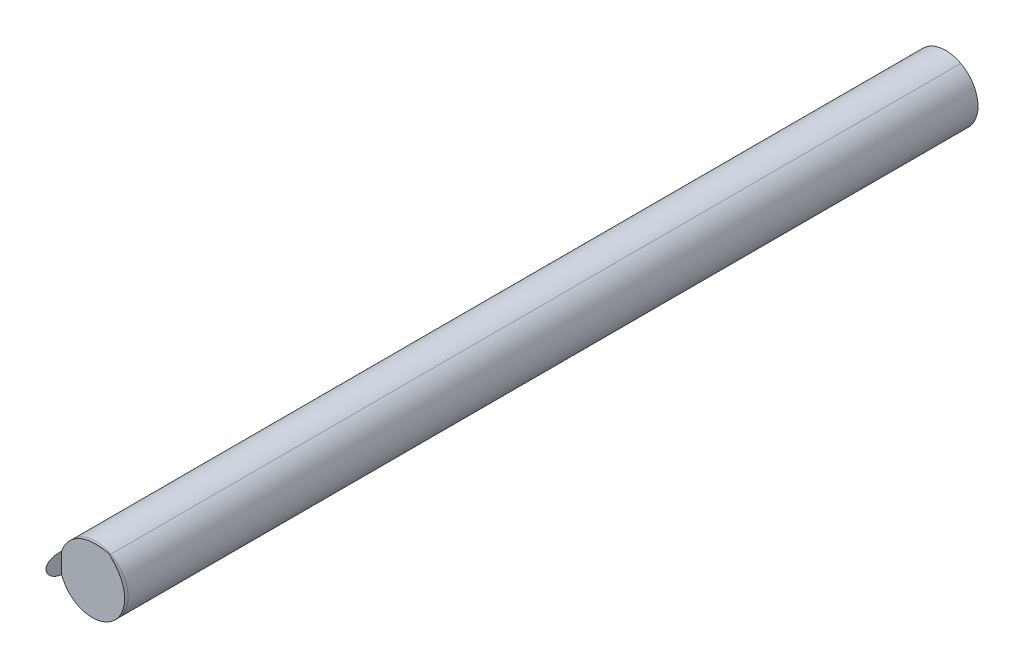
ISO-10303-21;
HEADER;
FILE_DESCRIPTION(('STEP AP214'),'2;1');
FILE_NAME('part.step','',(''),(''),'','','');
FILE_SCHEMA(('AUTOMOTIVE_DESIGN { 1 0 10303 214 1 1 1 1 }'));
ENDSEC;
DATA;
#1=APPLICATION_CONTEXT('core data for automotive mechanical design processes');
#2=APPLICATION_PROTOCOL_DEFINITION('international standard','automotive_design',2000,#1);
#3=PRODUCT_CONTEXT('',#1,'mechanical');
#4=PRODUCT('Part','Part','',(#3));
#5=PRODUCT_RELATED_PRODUCT_CATEGORY('part','',(#4));
#6=PRODUCT_DEFINITION_FORMATION('','',#4);
#7=PRODUCT_DEFINITION_CONTEXT('part definition',#1,'design');
#8=PRODUCT_DEFINITION('design','',#6,#7);
#9=PRODUCT_DEFINITION_SHAPE('','',#8);
#10=(LENGTH_UNIT() NAMED_UNIT(*) SI_UNIT(.MILLI.,.METRE.));
#11=(NAMED_UNIT(*) PLANE_ANGLE_UNIT() SI_UNIT($,.RADIAN.));
#12=(NAMED_UNIT(*) SI_UNIT($,.STERADIAN.) SOLID_ANGLE_UNIT());
#13=UNCERTAINTY_MEASURE_WITH_UNIT(LENGTH_MEASURE(1.E-05),#10,'distance_accuracy_value','');
#14=(GEOMETRIC_REPRESENTATION_CONTEXT(3) GLOBAL_UNCERTAINTY_ASSIGNED_CONTEXT((#13)) GLOBAL_UNIT_ASSIGNED_CONTEXT((#10,
#11,#12)) REPRESENTATION_CONTEXT('',''));
#15=CARTESIAN_POINT('',(0.,0.,0.));
#16=DIRECTION('',(0.,0.,1.));
#17=DIRECTION('',(1.,0.,0.));
#18=AXIS2_PLACEMENT_3D('',#15,#16,#17);
#19=CARTESIAN_POINT('',(-2.527062506593,0.304851094896,-7.3152));
#20=DIRECTION('',(0.,0.,1.));
#21=DIRECTION('',(1.,0.,0.));
#22=AXIS2_PLACEMENT_3D('',#19,#20,#21);
#23=PLANE('',#22);
#24=CARTESIAN_POINT('',(-2.527062506593,0.304851094896,-7.3152));
#25=DIRECTION('',(0.,0.,1.));
#26=DIRECTION('',(0.467775560933961,0.883847285786927,0.));
#27=AXIS2_PLACEMENT_3D('',#24,#25,#26);
#28=CIRCLE('',#27,0.2286);
#29=CARTESIAN_POINT('',(-2.420129013364,0.506898584427,-7.3152));
#30=VERTEX_POINT('',#29);
#31=CARTESIAN_POINT('',(-2.633995999823,0.102803605365,-7.3152));
#32=VERTEX_POINT('',#31);
#33=EDGE_CURVE('E73',#30,#32,#28,.T.);
#34=ORIENTED_EDGE('',*,*,#33,.F.);
#35=CARTESIAN_POINT('',(-2.527062506593,0.304851094896,-7.3152));
#36=DIRECTION('',(0.,0.,1.));
#37=DIRECTION('',(-0.467775560933961,-0.883847285786927,0.));
#38=AXIS2_PLACEMENT_3D('',#35,#36,#37);
#39=CIRCLE('',#38,0.2286);
#40=EDGE_CURVE('E11',#32,#30,#39,.T.);
#41=ORIENTED_EDGE('',*,*,#40,.F.);
#42=EDGE_LOOP('',(#34,#41));
#43=FACE_BOUND('',#42,.T.);
#44=ADVANCED_FACE('F16',(#43),#23,.F.);
#45=CARTESIAN_POINT('',(-2.527062506593,0.304851094896,-1.175004));
#46=DIRECTION('',(0.,0.,1.));
#47=DIRECTION('',(0.467775560933961,0.883847285786927,0.));
#48=AXIS2_PLACEMENT_3D('',#45,#46,#47);
#49=CYLINDRICAL_SURFACE('',#48,0.2286);
#50=DIRECTION('',(0.,0.,1.));
#51=VECTOR('',#50,1.);
#52=CARTESIAN_POINT('',(-2.633995999823,0.102803605365,-7.3152));
#53=LINE('',#52,#51);
#54=CARTESIAN_POINT('',(-2.633995999823,0.102803605365,-1.2954));
#55=VERTEX_POINT('',#54);
#56=EDGE_CURVE('E27',#32,#55,#53,.T.);
#57=ORIENTED_EDGE('',*,*,#56,.F.);
#58=ORIENTED_EDGE('',*,*,#40,.T.);
#59=DIRECTION('',(0.,0.,-1.));
#60=VECTOR('',#59,1.);
#61=CARTESIAN_POINT('',(-2.420129013364,0.506898584427,-1.2954));
#62=LINE('',#61,#60);
#63=CARTESIAN_POINT('',(-2.420129013364,0.506898584427,-1.2954));
#64=VERTEX_POINT('',#63);
#65=EDGE_CURVE('E20',#64,#30,#62,.T.);
#66=ORIENTED_EDGE('',*,*,#65,.F.);
#67=CARTESIAN_POINT('',(-2.527062506593,0.304851094896,-1.2954));
#68=DIRECTION('',(0.,0.,1.));
#69=DIRECTION('',(-0.467775560933961,-0.883847285786927,0.));
#70=AXIS2_PLACEMENT_3D('',#67,#68,#69);
#71=CIRCLE('',#70,0.2286);
#72=EDGE_CURVE('E68',#55,#64,#71,.T.);
#73=ORIENTED_EDGE('',*,*,#72,.F.);
#74=EDGE_LOOP('',(#57,#58,#66,#73));
#75=FACE_BOUND('',#74,.T.);
#76=ADVANCED_FACE('F66',(#75),#49,.T.);
#77=CARTESIAN_POINT('',(-2.527062506593,0.304851094896,-1.175004));
#78=DIRECTION('',(0.,0.,1.));
#79=DIRECTION('',(0.467775560933961,0.883847285786927,0.));
#80=AXIS2_PLACEMENT_3D('',#77,#78,#79);
#81=CYLINDRICAL_SURFACE('',#80,0.2286);
#82=ORIENTED_EDGE('',*,*,#65,.T.);
#83=ORIENTED_EDGE('',*,*,#33,.T.);
#84=ORIENTED_EDGE('',*,*,#56,.T.);
#85=CARTESIAN_POINT('',(-2.527062506593,0.304851094896,-1.2954));
#86=DIRECTION('',(0.,0.,1.));
#87=DIRECTION('',(0.467775560933961,0.883847285786927,0.));
#88=AXIS2_PLACEMENT_3D('',#85,#86,#87);
#89=CIRCLE('',#88,0.2286);
#90=EDGE_CURVE('E76',#64,#55,#89,.T.);
#91=ORIENTED_EDGE('',*,*,#90,.F.);
#92=EDGE_LOOP('',(#82,#83,#84,#91));
#93=FACE_BOUND('',#92,.T.);
#94=ADVANCED_FACE('F18',(#93),#81,.T.);
#95=CARTESIAN_POINT('',(-2.7432,0.305444522718,-1.214337255931));
#96=DIRECTION('',(1.,0.,0.));
#97=DIRECTION('',(0.,1.,0.));
#98=AXIS2_PLACEMENT_3D('',#95,#96,#97);
#99=PLANE('',#98);
#100=DIRECTION('',(1.44277346675194E-06,-0.999999999998959,0.));
#101=VECTOR('',#100,1.);
#102=CARTESIAN_POINT('',(-2.7432,0.378755047888,-1.27));
#103=LINE('',#102,#101);
#104=CARTESIAN_POINT('',(-2.7432,0.378755047888,-1.27));
#105=VERTEX_POINT('',#104);
#106=CARTESIAN_POINT('',(-2.743199788459,0.23213406902,-1.27));
#107=VERTEX_POINT('',#106);
#108=EDGE_CURVE('E105',#105,#107,#103,.T.);
#109=ORIENTED_EDGE('',*,*,#108,.F.);
#110=CARTESIAN_POINT('',(-2.7432,0.378755047888,-1.27));
#111=CARTESIAN_POINT('',(-2.7432,0.378449336978,-1.263068221462));
#112=CARTESIAN_POINT('',(-2.7432,0.377593387648,-1.249968528766));
#113=CARTESIAN_POINT('',(-2.7432,0.375619090815,-1.232696321735));
#114=CARTESIAN_POINT('',(-2.7432,0.37294238399,-1.21753901621));
#115=CARTESIAN_POINT('',(-2.7432,0.369549418818,-1.20434708734));
#116=CARTESIAN_POINT('',(-2.7432,0.365455102226,-1.19303346854));
#117=CARTESIAN_POINT('',(-2.7432,0.360728343474,-1.183566597399));
#118=CARTESIAN_POINT('',(-2.7432,0.355532722964,-1.175930688722));
#119=CARTESIAN_POINT('',(-2.7432,0.349943584336,-1.169883428331));
#120=CARTESIAN_POINT('',(-2.7432,0.343893573842,-1.16516233137));
#121=CARTESIAN_POINT('',(-2.7432,0.337326491277,-1.161674078895));
#122=CARTESIAN_POINT('',(-2.7432,0.330177005455,-1.159409019778));
#123=CARTESIAN_POINT('',(-2.7432,0.322341812543,-1.158449433279));
#124=CARTESIAN_POINT('',(-2.743200000003,0.313857314856,-1.158955841191));
#125=CARTESIAN_POINT('',(-2.74319999999,0.304622840048,-1.161147722582));
#126=CARTESIAN_POINT('',(-2.743200000036,0.294655973921,-1.165351488717));
#127=CARTESIAN_POINT('',(-2.743199999865,0.284193642636,-1.171840365509));
#128=CARTESIAN_POINT('',(-2.743200000505,0.273433956629,-1.180934686026));
#129=CARTESIAN_POINT('',(-2.74319999811,0.262704534119,-1.192929124776));
#130=CARTESIAN_POINT('',(-2.743200007048,0.252406986268,-1.208184337245));
#131=CARTESIAN_POINT('',(-2.743199973693,0.243338916169,-1.22648763833));
#132=CARTESIAN_POINT('',(-2.743200098176,0.236236367469,-1.247340451931));
#133=CARTESIAN_POINT('',(-2.743199788459,0.233200415772,-1.262236426228));
#134=CARTESIAN_POINT('',(-2.743199788459,0.23213406902,-1.27));
#135=(BOUNDED_CURVE() B_SPLINE_CURVE(3,(#110,#111,#112,#113,#114,#115,#116,#117,#118,#119,#120,
#121,#122,#123,#124,#125,#126,#127,#128,#129,#130,#131,#132,#133,#134),.UNSPECIFIED.,.F.,
.F.) B_SPLINE_CURVE_WITH_KNOTS((4,1,1,1,1,1,1,1,1,1,1,1,1,1,1,1,1,1,1,1,1,1,4),(0.,
0.04545454545455,0.09090909090909,0.136363636364,0.181818181818,0.227272727273,0.272727272727,
0.318181818182,0.363636363636,0.409090909091,0.454545454545,0.5,0.545454545455,0.590909090909,
0.636363636364,0.681818181818,0.727272727273,0.772727272727,0.818181818182,0.863636363636,
0.909090909091,0.954545454545,1.),
.UNSPECIFIED.) CURVE() GEOMETRIC_REPRESENTATION_ITEM() RATIONAL_B_SPLINE_CURVE((1.,1.,1.,1.,1.,
1.,1.,1.,1.,1.,1.,1.,1.,1.,1.,1.,1.,1.,1.,1.,1.,1.,1.,1.,1.)) REPRESENTATION_ITEM(''));
#136=EDGE_CURVE('E74',#105,#107,#135,.T.);
#137=ORIENTED_EDGE('',*,*,#136,.T.);
#138=EDGE_LOOP('',(#109,#137));
#139=FACE_BOUND('',#138,.T.);
#140=ADVANCED_FACE('F159',(#139),#99,.T.);
#141=CARTESIAN_POINT('',(-2.408247514116,0.529348305486,-1.2954));
#142=DIRECTION('',(0.883847285786927,-0.467775560933961,0.));
#143=DIRECTION('',(0.,0.,-1.));
#144=AXIS2_PLACEMENT_3D('',#141,#142,#143);
#145=TOROIDAL_SURFACE('',#144,0.254,0.2286);
#146=CARTESIAN_POINT('',(-2.7432,0.378755047888,-1.27));
#147=CARTESIAN_POINT('',(-2.740244309559,0.387519009784,-1.27));
#148=CARTESIAN_POINT('',(-2.733328224133,0.404561141289,-1.27));
#149=CARTESIAN_POINT('',(-2.719920940104,0.428820329001,-1.27));
#150=CARTESIAN_POINT('',(-2.70366818167,0.451359465569,-1.27));
#151=CARTESIAN_POINT('',(-2.684766119344,0.47189359078,-1.27));
#152=CARTESIAN_POINT('',(-2.663373165041,0.490171529244,-1.27));
#153=CARTESIAN_POINT('',(-2.63997526137,0.505776745116,-1.27));
#154=CARTESIAN_POINT('',(-2.614372296249,0.518831250327,-1.27));
#155=CARTESIAN_POINT('',(-2.586111704185,0.529149717547,-1.27));
#156=CARTESIAN_POINT('',(-2.557954015809,0.535769145465,-1.27));
#157=CARTESIAN_POINT('',(-2.531540360337,0.539136364368,-1.27));
#158=CARTESIAN_POINT('',(-2.507512297103,0.540111468916,-1.27));
#159=CARTESIAN_POINT('',(-2.484628936831,0.539439237876,-1.27));
#160=CARTESIAN_POINT('',(-2.461533844031,0.537408105221,-1.27));
#161=CARTESIAN_POINT('',(-2.436902113091,0.534096857967,-1.27));
#162=CARTESIAN_POINT('',(-2.418131252778,0.530994306169,-1.27));
#163=CARTESIAN_POINT('',(-2.408247514116,0.529348305486,-1.27));
#164=(BOUNDED_CURVE() B_SPLINE_CURVE(3,(#146,#147,#148,#149,#150,#151,#152,#153,#154,#155,#156,
#157,#158,#159,#160,#161,#162,#163),.UNSPECIFIED.,.F.,.F.) B_SPLINE_CURVE_WITH_KNOTS((4,1,1,1,1,
1,1,1,1,1,1,1,1,1,1,4),(0.,0.06666666666667,0.133333333333,0.2,0.266666666667,0.333333333333,
0.4,0.466666666667,0.533333333333,0.6,0.666666666667,0.733333333333,0.8,0.866666666667,
0.933333333333,1.),
.UNSPECIFIED.) CURVE() GEOMETRIC_REPRESENTATION_ITEM() RATIONAL_B_SPLINE_CURVE((1.,1.,1.,1.,1.,
1.,1.,1.,1.,1.,1.,1.,1.,1.,1.,1.,1.,1.)) REPRESENTATION_ITEM(''));
#165=CARTESIAN_POINT('',(-2.408247514116,0.529348305486,-1.27));
#166=VERTEX_POINT('',#165);
#167=EDGE_CURVE('E87',#105,#166,#164,.T.);
#168=ORIENTED_EDGE('',*,*,#167,.T.);
#169=CARTESIAN_POINT('',(-2.408247514116,0.529348305486,-1.2954));
#170=DIRECTION('',(-0.883847285786927,0.467775560933961,0.));
#171=DIRECTION('',(-0.467775560933961,-0.883847285786927,0.));
#172=AXIS2_PLACEMENT_3D('',#169,#170,#171);
#173=CIRCLE('',#172,0.0254);
#174=EDGE_CURVE('E84',#64,#166,#173,.T.);
#175=ORIENTED_EDGE('',*,*,#174,.F.);
#176=ORIENTED_EDGE('',*,*,#90,.T.);
#177=CARTESIAN_POINT('',(-2.408247514116,0.529348305486,-1.2954));
#178=DIRECTION('',(0.883847285786976,-0.467775560933869,0.));
#179=DIRECTION('',(-0.467127224422766,-0.882622274235558,0.0526315231238237));
#180=AXIS2_PLACEMENT_3D('',#177,#178,#179);
#181=CIRCLE('',#180,0.4826);
#182=CARTESIAN_POINT('',(-2.633683112179,0.103394796777,-1.27000000898));
#183=VERTEX_POINT('',#182);
#184=EDGE_CURVE('E95',#183,#55,#181,.T.);
#185=ORIENTED_EDGE('',*,*,#184,.F.);
#186=CARTESIAN_POINT('',(-2.743199788459,0.23213406902,-1.27));
#187=CARTESIAN_POINT('',(-2.738522241118,0.218295133512,-1.27));
#188=CARTESIAN_POINT('',(-2.726753881307,0.192057443218,-1.269999999679));
#189=CARTESIAN_POINT('',(-2.70182655344,0.156337358821,-1.270000001122));
#190=CARTESIAN_POINT('',(-2.67056862076,0.126021575578,-1.269999995831));
#191=CARTESIAN_POINT('',(-2.646577750629,0.110219275202,-1.27000000898));
#192=CARTESIAN_POINT('',(-2.633683112179,0.103394796777,-1.27000000898));
#193=(BOUNDED_CURVE() B_SPLINE_CURVE(3,(#186,#187,#188,#189,#190,#191,#192),.UNSPECIFIED.,.F.,
.F.) B_SPLINE_CURVE_WITH_KNOTS((4,1,1,1,4),(0.,0.25,0.5,0.75,1.),
.UNSPECIFIED.) CURVE() GEOMETRIC_REPRESENTATION_ITEM() RATIONAL_B_SPLINE_CURVE((1.,1.,1.,1.,1.,
1.,1.)) REPRESENTATION_ITEM(''));
#194=EDGE_CURVE('E81',#107,#183,#193,.T.);
#195=ORIENTED_EDGE('',*,*,#194,.F.);
#196=ORIENTED_EDGE('',*,*,#136,.F.);
#197=EDGE_LOOP('',(#168,#175,#176,#185,#195,#196));
#198=FACE_BOUND('',#197,.T.);
#199=ADVANCED_FACE('F85',(#198),#145,.T.);
#200=CARTESIAN_POINT('',(-2.520284959729,0.308363673236,-1.27));
#201=DIRECTION('',(0.,0.,1.));
#202=DIRECTION('',(1.,0.,0.));
#203=AXIS2_PLACEMENT_3D('',#200,#201,#202);
#204=PLANE('',#203);
#205=ORIENTED_EDGE('',*,*,#167,.F.);
#206=ORIENTED_EDGE('',*,*,#108,.T.);
#207=ORIENTED_EDGE('',*,*,#194,.T.);
#208=CARTESIAN_POINT('',(-2.408247514116,0.529348305486,-1.27));
#209=CARTESIAN_POINT('',(-2.400877928833,0.521629748951,-1.27));
#210=CARTESIAN_POINT('',(-2.386949143225,0.507004063453,-1.27));
#211=CARTESIAN_POINT('',(-2.369300694129,0.487147439183,-1.27));
#212=CARTESIAN_POINT('',(-2.354415386148,0.46854600387,-1.27));
#213=CARTESIAN_POINT('',(-2.341836329779,0.450705483092,-1.27));
#214=CARTESIAN_POINT('',(-2.331103827775,0.433144078207,-1.27));
#215=CARTESIAN_POINT('',(-2.321871470762,0.415405790275,-1.27));
#216=CARTESIAN_POINT('',(-2.313785785331,0.396650455592,-1.27));
#217=CARTESIAN_POINT('',(-2.30677021933,0.376016190311,-1.27));
#218=CARTESIAN_POINT('',(-2.301073238472,0.352401373663,-1.27));
#219=CARTESIAN_POINT('',(-2.297601570295,0.326345122896,-1.27));
#220=CARTESIAN_POINT('',(-2.29705947637,0.298746607749,-1.27));
#221=CARTESIAN_POINT('',(-2.299877073329,0.270623383628,-1.27));
#222=CARTESIAN_POINT('',(-2.305920497862,0.24358492697,-1.27));
#223=CARTESIAN_POINT('',(-2.314998839548,0.217716522814,-1.27));
#224=CARTESIAN_POINT('',(-2.327022310584,0.193158318536,-1.27));
#225=CARTESIAN_POINT('',(-2.341913879043,0.170124746274,-1.27));
#226=CARTESIAN_POINT('',(-2.359328391321,0.149136803143,-1.27));
#227=CARTESIAN_POINT('',(-2.379118710676,0.130339166815,-1.27));
#228=CARTESIAN_POINT('',(-2.400919585788,0.114071136862,-1.27));
#229=CARTESIAN_POINT('',(-2.424535276391,0.100472800217,-1.270000000001));
#230=CARTESIAN_POINT('',(-2.449526652118,0.08979710872996,-1.269999999998));
#231=CARTESIAN_POINT('',(-2.475638013606,0.0821453514093,-1.270000000006));
#232=CARTESIAN_POINT('',(-2.502423424964,0.07764928392231,-1.269999999978));
#233=CARTESIAN_POINT('',(-2.529576914692,0.07635487806047,-1.27000000008));
#234=CARTESIAN_POINT('',(-2.556665904308,0.07828638608414,-1.269999999701));
#235=CARTESIAN_POINT('',(-2.583340272501,0.08341072935923,-1.270000001117));
#236=CARTESIAN_POINT('',(-2.609234947339,0.09167162099409,-1.269999995832));
#237=CARTESIAN_POINT('',(-2.625658284144,0.09914766212384,-1.27000000898));
#238=CARTESIAN_POINT('',(-2.633683112179,0.103394796777,-1.27000000898));
#239=(BOUNDED_CURVE() B_SPLINE_CURVE(3,(#208,#209,#210,#211,#212,#213,#214,#215,#216,#217,#218,
#219,#220,#221,#222,#223,#224,#225,#226,#227,#228,#229,#230,#231,#232,#233,#234,#235,#236,#237,
#238),.UNSPECIFIED.,.F.,.F.) B_SPLINE_CURVE_WITH_KNOTS((4,1,1,1,1,1,1,1,1,1,1,1,1,1,1,1,1,1,1,1,
1,1,1,1,1,1,1,1,4),(0.,0.03571428571429,0.07142857142857,0.107142857143,0.142857142857,
0.178571428571,0.214285714286,0.25,0.285714285714,0.321428571429,0.357142857143,0.392857142857,
0.428571428571,0.464285714286,0.5,0.535714285714,0.571428571429,0.607142857143,0.642857142857,
0.678571428571,0.714285714286,0.75,0.785714285714,0.821428571429,0.857142857143,0.892857142857,
0.928571428571,0.964285714286,1.),
.UNSPECIFIED.) CURVE() GEOMETRIC_REPRESENTATION_ITEM() RATIONAL_B_SPLINE_CURVE((1.,1.,1.,1.,1.,
1.,1.,1.,1.,1.,1.,1.,1.,1.,1.,1.,1.,1.,1.,1.,1.,1.,1.,1.,1.,1.,1.,1.,1.,1.,1.)) REPRESENTATION_ITEM(''));
#240=EDGE_CURVE('E92',#166,#183,#239,.T.);
#241=ORIENTED_EDGE('',*,*,#240,.F.);
#242=EDGE_LOOP('',(#205,#206,#207,#241));
#243=FACE_BOUND('',#242,.T.);
#244=ADVANCED_FACE('F156',(#243),#204,.T.);
#245=CARTESIAN_POINT('',(-2.408247514116,0.529348305486,-1.2954));
#246=DIRECTION('',(0.883847285786927,-0.467775560933961,0.));
#247=DIRECTION('',(0.,0.,-1.));
#248=AXIS2_PLACEMENT_3D('',#245,#246,#247);
#249=TOROIDAL_SURFACE('',#248,0.254,0.2286);
#250=ORIENTED_EDGE('',*,*,#184,.T.);
#251=ORIENTED_EDGE('',*,*,#72,.T.);
#252=ORIENTED_EDGE('',*,*,#174,.T.);
#253=ORIENTED_EDGE('',*,*,#240,.T.);
#254=EDGE_LOOP('',(#250,#251,#252,#253));
#255=FACE_BOUND('',#254,.T.);
#256=ADVANCED_FACE('F94',(#255),#249,.T.);
#257=CLOSED_SHELL('',(#44,#76,#94,#140,#199,#244,#256));
#258=MANIFOLD_SOLID_BREP('B1',#257);
#259=ADVANCED_BREP_SHAPE_REPRESENTATION('',(#18,#258),#14);
#260=SHAPE_DEFINITION_REPRESENTATION(#9,#259);
ENDSEC;
END-ISO-10303-21;
